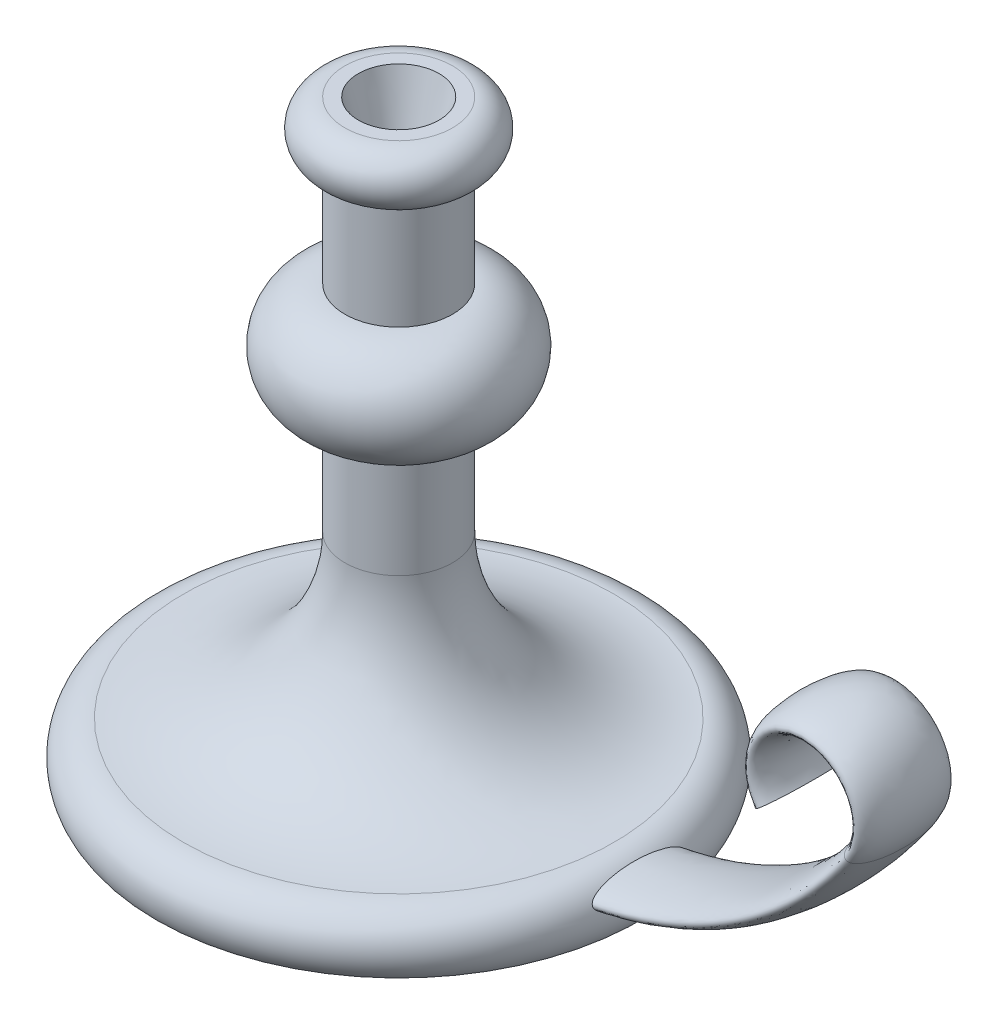
ISO-10303-21;
HEADER;
FILE_DESCRIPTION(('STEP AP214'),'2;1');
FILE_NAME('part.step','',(''),(''),'','','');
FILE_SCHEMA(('AUTOMOTIVE_DESIGN { 1 0 10303 214 1 1 1 1 }'));
ENDSEC;
DATA;
#1=APPLICATION_CONTEXT('core data for automotive mechanical design processes');
#2=APPLICATION_PROTOCOL_DEFINITION('international standard','automotive_design',2000,#1);
#3=PRODUCT_CONTEXT('',#1,'mechanical');
#4=PRODUCT('Part','Part','',(#3));
#5=PRODUCT_RELATED_PRODUCT_CATEGORY('part','',(#4));
#6=PRODUCT_DEFINITION_FORMATION('','',#4);
#7=PRODUCT_DEFINITION_CONTEXT('part definition',#1,'design');
#8=PRODUCT_DEFINITION('design','',#6,#7);
#9=PRODUCT_DEFINITION_SHAPE('','',#8);
#10=(LENGTH_UNIT() NAMED_UNIT(*) SI_UNIT(.MILLI.,.METRE.));
#11=(NAMED_UNIT(*) PLANE_ANGLE_UNIT() SI_UNIT($,.RADIAN.));
#12=(NAMED_UNIT(*) SI_UNIT($,.STERADIAN.) SOLID_ANGLE_UNIT());
#13=UNCERTAINTY_MEASURE_WITH_UNIT(LENGTH_MEASURE(1.E-05),#10,'distance_accuracy_value','');
#14=(GEOMETRIC_REPRESENTATION_CONTEXT(3) GLOBAL_UNCERTAINTY_ASSIGNED_CONTEXT((#13)) GLOBAL_UNIT_ASSIGNED_CONTEXT((#10,
#11,#12)) REPRESENTATION_CONTEXT('',''));
#15=CARTESIAN_POINT('',(0.,0.,0.));
#16=DIRECTION('',(0.,0.,1.));
#17=DIRECTION('',(1.,0.,0.));
#18=AXIS2_PLACEMENT_3D('',#15,#16,#17);
#19=CARTESIAN_POINT('',(0.,7.50000000000003,0.));
#20=DIRECTION('',(0.,-1.,0.));
#21=DIRECTION('',(0.,0.,-1.));
#22=AXIS2_PLACEMENT_3D('',#19,#20,#21);
#23=TOROIDAL_SURFACE('',#22,80.,12.5);
#24=CARTESIAN_POINT('',(89.5597422043342,12.9414346567555,-17.5));
#25=CARTESIAN_POINT('',(89.5807278946485,12.8988393157081,-17.5000019534777));
#26=CARTESIAN_POINT('',(89.6018125795404,12.8563039357769,-17.4977816975197));
#27=CARTESIAN_POINT('',(89.6440155813562,12.7716938339371,-17.489002543543));
#28=CARTESIAN_POINT('',(89.6651339056647,12.7296192360718,-17.4824425050804));
#29=CARTESIAN_POINT('',(89.728328929782,12.6045076597417,-17.4565216692095));
#30=CARTESIAN_POINT('',(89.7702246464786,12.5226255894255,-17.4309204730636));
#31=CARTESIAN_POINT('',(89.8644276523312,12.3407735771966,-17.3563532007827));
#32=CARTESIAN_POINT('',(89.916211748319,12.242484901666,-17.3027527423027));
#33=CARTESIAN_POINT('',(90.01638786814,12.0551458272008,-17.178826321144));
#34=CARTESIAN_POINT('',(90.0647710548456,11.966119226993,-17.1084587296403));
#35=CARTESIAN_POINT('',(90.1524531790238,11.8069845229249,-16.9652391551481));
#36=CARTESIAN_POINT('',(90.1921458014336,11.7358878994478,-16.8936963434585));
#37=CARTESIAN_POINT('',(90.2690886261225,11.5996259068224,-16.7438969488311));
#38=CARTESIAN_POINT('',(90.3063367280021,11.5344656201533,-16.665634722265));
#39=CARTESIAN_POINT('',(90.3786756485819,11.4092540815105,-16.5039763875565));
#40=CARTESIAN_POINT('',(90.4137624747614,11.349212210629,-16.4205713158719));
#41=CARTESIAN_POINT('',(90.4819450166471,11.2336894025402,-16.2499454917114));
#42=CARTESIAN_POINT('',(90.5150413047902,11.1782071523835,-16.162725848809));
#43=CARTESIAN_POINT('',(90.5839705930101,11.0637251825689,-15.9728919395737));
#44=CARTESIAN_POINT('',(90.6195406839562,11.0053156128849,-15.8698282905888));
#45=CARTESIAN_POINT('',(90.6886668526269,10.8929143897208,-15.6606649910659));
#46=CARTESIAN_POINT('',(90.7222226971282,10.8389232475745,-15.5545649910506));
#47=CARTESIAN_POINT('',(90.787486486134,10.7348751403119,-15.3401290691865));
#48=CARTESIAN_POINT('',(90.8191972688173,10.6848120890841,-15.2317969483067));
#49=CARTESIAN_POINT('',(90.881005962979,10.5880683385414,-15.0131968985225));
#50=CARTESIAN_POINT('',(90.9111039714558,10.5413874357516,-14.9029290865687));
#51=CARTESIAN_POINT('',(90.979897363352,10.4355491517098,-14.6427529331226));
#52=CARTESIAN_POINT('',(91.0180072010883,10.377593665576,-14.4922012075481));
#53=CARTESIAN_POINT('',(91.0918875553169,10.2663462891692,-14.1888070722871));
#54=CARTESIAN_POINT('',(91.1276577411367,10.2130550577559,-14.0359643425398));
#55=CARTESIAN_POINT('',(91.1971197458645,10.1105127689612,-13.7282685712582));
#56=CARTESIAN_POINT('',(91.2308091946811,10.0612662985098,-13.573413471871));
#57=CARTESIAN_POINT('',(91.2962483962878,9.96642044574799,-13.262180104172));
#58=CARTESIAN_POINT('',(91.3279980241889,9.92082129819992,-13.1058017385396));
#59=CARTESIAN_POINT('',(91.4205951755327,9.78887458660797,-12.6346162266685));
#60=CARTESIAN_POINT('',(91.4787589060981,9.70742476979595,-12.3179025042442));
#61=CARTESIAN_POINT('',(91.5890957852254,9.55493826130152,-11.6792188898602));
#62=CARTESIAN_POINT('',(91.641236506382,9.48395741425905,-11.357230318611));
#63=CARTESIAN_POINT('',(91.7397682682944,9.35136221163196,-10.7107316640823));
#64=CARTESIAN_POINT('',(91.7861636672357,9.28974074823245,-10.3862236929834));
#65=CARTESIAN_POINT('',(91.8736976604511,9.17463718318053,-9.73512886653572));
#66=CARTESIAN_POINT('',(91.9148370779327,9.12115380666535,-9.40854234516818));
#67=CARTESIAN_POINT('',(91.9930777751443,9.02031209920317,-8.74630339912616));
#68=CARTESIAN_POINT('',(92.0300669877613,8.97311921137159,-8.4106126926434));
#69=CARTESIAN_POINT('',(92.0991833927575,8.88559842477434,-7.73783252743947));
#70=CARTESIAN_POINT('',(92.1313104056235,8.84527077946752,-7.40074301754614));
#71=CARTESIAN_POINT('',(92.1909161961866,8.77092313439268,-6.72537142355348));
#72=CARTESIAN_POINT('',(92.2183937480205,8.73690479789182,-6.38708904887194));
#73=CARTESIAN_POINT('',(92.2688480816039,8.674768403045,-5.70964427774293));
#74=CARTESIAN_POINT('',(92.2918247141674,8.64665054027193,-5.37048185250302));
#75=CARTESIAN_POINT('',(92.3540877228586,8.57076604630488,-4.35367181244671));
#76=CARTESIAN_POINT('',(92.3868571977359,8.53128338370555,-3.6749838964165));
#77=CARTESIAN_POINT('',(92.4356134743347,8.47274161832895,-2.31614711504073));
#78=CARTESIAN_POINT('',(92.4515998737813,8.45368300509715,-1.63599821506827));
#79=CARTESIAN_POINT('',(92.4661200478781,8.43637339284854,-0.357955102331974));
#80=CARTESIAN_POINT('',(92.4665389208555,8.43587490179707,0.239888856143631));
#81=CARTESIAN_POINT('',(92.4546362797528,8.4500624126083,1.43536153859163));
#82=CARTESIAN_POINT('',(92.4423128974783,8.46475064105844,2.0329902181484));
#83=CARTESIAN_POINT('',(92.4047541650815,8.50976680779929,3.22745109478543));
#84=CARTESIAN_POINT('',(92.379514731688,8.54009969200437,3.82428298010724));
#85=CARTESIAN_POINT('',(92.3157217367252,8.61743320229676,5.01694606233261));
#86=CARTESIAN_POINT('',(92.2771508465328,8.66445552395919,5.61277493756131));
#87=CARTESIAN_POINT('',(92.1861026743767,8.77678784246256,6.80153886380942));
#88=CARTESIAN_POINT('',(92.1336290020919,8.84209309262499,7.39447462535094));
#89=CARTESIAN_POINT('',(92.0437550848418,8.95574227206711,8.28055229820517));
#90=CARTESIAN_POINT('',(92.0119455213755,8.99622894552013,8.57528682166731));
#91=CARTESIAN_POINT('',(91.9444204496405,9.08291539794889,9.16346094428889));
#92=CARTESIAN_POINT('',(91.9087051114865,9.12911492811459,9.4569005992672));
#93=CARTESIAN_POINT('',(91.8331309715698,9.22782929334069,10.0422906036684));
#94=CARTESIAN_POINT('',(91.7932707518514,9.28034629056383,10.3342404073469));
#95=CARTESIAN_POINT('',(91.7091179167369,9.39245062081631,10.9161852811053));
#96=CARTESIAN_POINT('',(91.6648247441272,9.45203884286031,11.2061801005453));
#97=CARTESIAN_POINT('',(91.5713925727481,9.57931645333882,11.7838191658169));
#98=CARTESIAN_POINT('',(91.5222504482681,9.64701107336927,12.0714617643073));
#99=CARTESIAN_POINT('',(91.4186796874406,9.79172730085909,12.6430805537632));
#100=CARTESIAN_POINT('',(91.3642572573635,9.86873798424097,12.9270606150355));
#101=CARTESIAN_POINT('',(91.2493765391174,10.033952974788,13.4904217181467));
#102=CARTESIAN_POINT('',(91.1889212109097,10.1221517983454,13.7698049377449));
#103=CARTESIAN_POINT('',(91.0929373870874,10.2648274882363,14.1839125047647));
#104=CARTESIAN_POINT('',(91.0600757486261,10.314090418185,14.3210581267387));
#105=CARTESIAN_POINT('',(90.9923938569386,10.4165511027192,14.593376347765));
#106=CARTESIAN_POINT('',(90.9575737807137,10.4697485018484,14.7285491237345));
#107=CARTESIAN_POINT('',(90.8810851838777,10.587845134408,15.0138774923678));
#108=CARTESIAN_POINT('',(90.8391147723957,10.6533666208412,15.1636969104749));
#109=CARTESIAN_POINT('',(90.7519625692612,10.7912189771815,15.4593295355901));
#110=CARTESIAN_POINT('',(90.7067794219568,10.8635527258308,15.605141014985));
#111=CARTESIAN_POINT('',(90.6128939496975,11.0160439629677,15.8905749729623));
#112=CARTESIAN_POINT('',(90.5642084544311,11.0961646105686,16.0302224467125));
#113=CARTESIAN_POINT('',(90.4624897667354,11.2662530107873,16.3016394850687));
#114=CARTESIAN_POINT('',(90.4094613083908,11.3562100760681,16.4334173639363));
#115=CARTESIAN_POINT('',(90.3114276481005,11.5255085385048,16.6553108138959));
#116=CARTESIAN_POINT('',(90.2675273757817,11.6022608890606,16.747864447136));
#117=CARTESIAN_POINT('',(90.1761749534326,11.7643292238687,16.9236630994731));
#118=CARTESIAN_POINT('',(90.1287172073378,11.849658775493,17.0068929161981));
#119=CARTESIAN_POINT('',(90.0292807633426,12.0313291797368,17.160728121925));
#120=CARTESIAN_POINT('',(89.9772518064337,12.1277974407354,17.2311575389091));
#121=CARTESIAN_POINT('',(89.8965437818878,12.2800613987942,17.3212876850735));
#122=CARTESIAN_POINT('',(89.8692277989253,12.3320164153137,17.3487242132161));
#123=CARTESIAN_POINT('',(89.8138320311431,12.4382955168478,17.3975211145679));
#124=CARTESIAN_POINT('',(89.7857527202502,12.4926181439799,17.4188851676711));
#125=CARTESIAN_POINT('',(89.7185869780336,12.6237048005599,17.4611772226903));
#126=CARTESIAN_POINT('',(89.6792533408886,12.7013692224277,17.4790502108363));
#127=CARTESIAN_POINT('',(89.6005512815564,12.8586256339485,17.4997317533412));
#128=CARTESIAN_POINT('',(89.5611829132233,12.9382160139949,17.5025524785485));
#129=CARTESIAN_POINT('',(89.4835317885696,13.0969633423244,17.4927372657774));
#130=CARTESIAN_POINT('',(89.4452490812937,13.1761202708964,17.4801006306501));
#131=CARTESIAN_POINT('',(89.3707047667355,13.3318071774563,17.440649407729));
#132=CARTESIAN_POINT('',(89.3344452993771,13.4083343423531,17.4138201116179));
#133=CARTESIAN_POINT('',(89.2510611220235,13.5858554385683,17.3357126521072));
#134=CARTESIAN_POINT('',(89.2050998650831,13.684982377722,17.2790047620841));
#135=CARTESIAN_POINT('',(89.1180744174556,13.874427631182,17.1491670423826));
#136=CARTESIAN_POINT('',(89.0770301058259,13.9647099356687,17.0759737821298));
#137=CARTESIAN_POINT('',(89.0037033744711,14.1271434857571,16.9270577307039));
#138=CARTESIAN_POINT('',(88.9709541551903,14.2001945680732,16.8525208708986));
#139=CARTESIAN_POINT('',(88.908496842619,14.3401811690449,16.697029269211));
#140=CARTESIAN_POINT('',(88.8787841266134,14.4071259665769,16.6160846261893));
#141=CARTESIAN_POINT('',(88.8217814388549,14.5359995630883,16.4490709627678));
#142=CARTESIAN_POINT('',(88.7944998605827,14.5979109242412,16.362985782321));
#143=CARTESIAN_POINT('',(88.7420667437369,14.717173406466,16.1870697873631));
#144=CARTESIAN_POINT('',(88.7169159331093,14.7745229686601,16.0972377082951));
#145=CARTESIAN_POINT('',(88.6682699235337,14.8855899090513,15.9140699306462));
#146=CARTESIAN_POINT('',(88.6447869137156,14.9392804489426,15.8207148279059));
#147=CARTESIAN_POINT('',(88.5993971939428,15.0431008843882,15.6316626961433));
#148=CARTESIAN_POINT('',(88.5774907604158,15.0932301555102,15.5359652603524));
#149=CARTESIAN_POINT('',(88.513751478622,15.2390285874186,15.2458062448787));
#150=CARTESIAN_POINT('',(88.4739596847913,15.329968547736,15.0485147207847));
#151=CARTESIAN_POINT('',(88.3985337506615,15.5017775203626,14.6487152633388));
#152=CARTESIAN_POINT('',(88.3629029634839,15.5826384140041,14.4462032813474));
#153=CARTESIAN_POINT('',(88.2948356711212,15.7363066128672,14.0365764701689));
#154=CARTESIAN_POINT('',(88.2624142295169,15.8090761199816,13.8294450545349));
#155=CARTESIAN_POINT('',(88.2003835751382,15.9473648801957,13.412628987176));
#156=CARTESIAN_POINT('',(88.1707714189814,16.0128917338223,13.2029472733582));
#157=CARTESIAN_POINT('',(88.1139049361938,16.1377375745621,12.78149499463));
#158=CARTESIAN_POINT('',(88.0866500408508,16.1970580597505,12.5697249473626));
#159=CARTESIAN_POINT('',(88.027617257203,16.3244235662306,12.0912931700776));
#160=CARTESIAN_POINT('',(87.9964138193044,16.3909381265495,11.8241540502342));
#161=CARTESIAN_POINT('',(87.9367717636617,16.5165936764721,11.2878278414646));
#162=CARTESIAN_POINT('',(87.9083334164421,16.5757339447661,11.018640554927));
#163=CARTESIAN_POINT('',(87.8539266282972,16.6875098948958,10.4785408424879));
#164=CARTESIAN_POINT('',(87.8279593730487,16.7401424577996,10.2076276543189));
#165=CARTESIAN_POINT('',(87.7783184309331,16.8395301522938,9.66451167999782));
#166=CARTESIAN_POINT('',(87.7546448506396,16.8862850108119,9.39230883453876));
#167=CARTESIAN_POINT('',(87.6869994555325,17.0182803050949,8.57578965921736));
#168=CARTESIAN_POINT('',(87.6462388525846,17.0955854003688,8.02991167225398));
#169=CARTESIAN_POINT('',(87.5728065515611,17.2320145687303,6.93552385093938));
#170=CARTESIAN_POINT('',(87.5401330675682,17.2911426566328,6.38701462498024));
#171=CARTESIAN_POINT('',(87.4828441952971,17.3930876120975,5.28955884850833));
#172=CARTESIAN_POINT('',(87.4582074588681,17.4359477429323,4.74061740412483));
#173=CARTESIAN_POINT('',(87.4169410999172,17.5068884934702,3.64146108218668));
#174=CARTESIAN_POINT('',(87.4003119088603,17.534968316784,3.09124613761759));
#175=CARTESIAN_POINT('',(87.375169948199,17.5771566462025,1.98980868969185));
#176=CARTESIAN_POINT('',(87.3666614689744,17.5912577671532,1.43858580772097));
#177=CARTESIAN_POINT('',(87.3578539704596,17.6058511840596,0.335909067645271));
#178=CARTESIAN_POINT('',(87.3575547550008,17.6063438052041,-0.215544784625368));
#179=CARTESIAN_POINT('',(87.3651677510509,17.5937352162513,-1.31815822776248));
#180=CARTESIAN_POINT('',(87.3730787250644,17.5806360547996,-1.86931785045099));
#181=CARTESIAN_POINT('',(87.3970372477743,17.5404868292746,-2.97097544677729));
#182=CARTESIAN_POINT('',(87.4130850653538,17.513436304176,-3.52147339794745));
#183=CARTESIAN_POINT('',(87.4531996813082,17.4446213827576,-4.62112135666799));
#184=CARTESIAN_POINT('',(87.4772644593792,17.4028606933019,-5.17027166874152));
#185=CARTESIAN_POINT('',(87.5333316774061,17.3033707612731,-6.26670053623542));
#186=CARTESIAN_POINT('',(87.5653334299482,17.2456429015516,-6.81397924959393));
#187=CARTESIAN_POINT('',(87.6208220531231,17.1429049509084,-7.65503321383776));
#188=CARTESIAN_POINT('',(87.641467966926,17.104233324674,-7.94978028808903));
#189=CARTESIAN_POINT('',(87.6851649593457,17.0212250701554,-8.5382946276224));
#190=CARTESIAN_POINT('',(87.7082159678751,16.9768886069427,-8.83206192119917));
#191=CARTESIAN_POINT('',(87.7568106691338,16.8820510369679,-9.41827197236908));
#192=CARTESIAN_POINT('',(87.7823533406002,16.8315524537745,-9.71071522164857));
#193=CARTESIAN_POINT('',(87.8360989952266,16.7237193681049,-10.2940938312753));
#194=CARTESIAN_POINT('',(87.8643018909558,16.6663850902741,-10.5850292408479));
#195=CARTESIAN_POINT('',(87.9147712499548,16.5622842610504,-11.0784529887227));
#196=CARTESIAN_POINT('',(87.9362980252954,16.5174691899789,-11.2814293835338));
#197=CARTESIAN_POINT('',(87.9809118301304,16.4236835134751,-11.6862455623079));
#198=CARTESIAN_POINT('',(88.0039988123354,16.3747130339803,-11.8880853805194));
#199=CARTESIAN_POINT('',(88.0519198244944,16.2721215384759,-12.2905621648846));
#200=CARTESIAN_POINT('',(88.0767553337325,16.2184965755429,-12.4911979528416));
#201=CARTESIAN_POINT('',(88.1283787004668,16.1060707847339,-12.8907612736839));
#202=CARTESIAN_POINT('',(88.1551664933024,16.0472701282664,-13.0896888629022));
#203=CARTESIAN_POINT('',(88.2109999780505,15.9237718205576,-13.4854201231412));
#204=CARTESIAN_POINT('',(88.2400459194859,15.8590735174964,-13.6822235567011));
#205=CARTESIAN_POINT('',(88.3008027999433,15.7228691935852,-14.0730419872898));
#206=CARTESIAN_POINT('',(88.3325134779585,15.6513638393843,-14.2670572552402));
#207=CARTESIAN_POINT('',(88.3991424541961,15.5003948115858,-14.6511973591139));
#208=CARTESIAN_POINT('',(88.4340575115817,15.4209391715425,-14.8413258930663));
#209=CARTESIAN_POINT('',(88.5079196083049,15.2523848762564,-15.2164401400172));
#210=CARTESIAN_POINT('',(88.5468648114131,15.1632906117648,-15.4014281468494));
#211=CARTESIAN_POINT('',(88.6092096238852,15.0206579718868,-15.6733114229646));
#212=CARTESIAN_POINT('',(88.6306485895102,14.9716086740024,-15.7630166800374));
#213=CARTESIAN_POINT('',(88.6750422753313,14.870124861522,-15.9401002079375));
#214=CARTESIAN_POINT('',(88.6979967332498,14.8176909327198,-16.0274788777601));
#215=CARTESIAN_POINT('',(88.74568401018,14.7089478844273,-16.1993887567135));
#216=CARTESIAN_POINT('',(88.7704179688271,14.6526362825891,-16.2839180892544));
#217=CARTESIAN_POINT('',(88.821948485748,14.5356422617904,-16.4492391224754));
#218=CARTESIAN_POINT('',(88.8487445345049,14.4749609227744,-16.5300317386031));
#219=CARTESIAN_POINT('',(88.8976102788188,14.3647434848949,-16.666716843305));
#220=CARTESIAN_POINT('',(88.9191374191611,14.316323032208,-16.7236955334946));
#221=CARTESIAN_POINT('',(88.9637080676469,14.2164452982158,-16.8342912802674));
#222=CARTESIAN_POINT('',(88.9867519478514,14.1649872721062,-16.8879075056817));
#223=CARTESIAN_POINT('',(89.0583610181501,14.0058008216796,-17.0423310846556));
#224=CARTESIAN_POINT('',(89.1095289234105,13.8929758416956,-17.1370796109725));
#225=CARTESIAN_POINT('',(89.1999001554576,13.6963386208974,-17.2707956184665));
#226=CARTESIAN_POINT('',(89.2367505169323,13.6167644879682,-17.317550348063));
#227=CARTESIAN_POINT('',(89.3136877653851,13.452297416601,-17.3968468737186));
#228=CARTESIAN_POINT('',(89.3537667767867,13.3674175273964,-17.4294220837181));
#229=CARTESIAN_POINT('',(89.4217091217894,13.2251848973541,-17.4685967336684));
#230=CARTESIAN_POINT('',(89.448809384098,13.1688551716175,-17.4803204652976));
#231=CARTESIAN_POINT('',(89.5037947740349,13.0554594934971,-17.4960211898048));
#232=CARTESIAN_POINT('',(89.5316799819,12.9983934661741,-17.499997387795));
#233=CARTESIAN_POINT('',(89.5597422043342,12.9414346567555,-17.5));
#234=B_SPLINE_CURVE_WITH_KNOTS('',3,(#24,#25,#26,#27,#28,#29,#30,#31,#32,#33,#34,#35,#36,#37,
#38,#39,#40,#41,#42,#43,#44,#45,#46,#47,#48,#49,#50,#51,#52,#53,#54,#55,#56,#57,#58,#59,#60,#61,
#62,#63,#64,#65,#66,#67,#68,#69,#70,#71,#72,#73,#74,#75,#76,#77,#78,#79,#80,#81,#82,#83,#84,#85,
#86,#87,#88,#89,#90,#91,#92,#93,#94,#95,#96,#97,#98,#99,#100,#101,#102,#103,#104,#105,#106,#107,
#108,#109,#110,#111,#112,#113,#114,#115,#116,#117,#118,#119,#120,#121,#122,#123,#124,#125,#126,
#127,#128,#129,#130,#131,#132,#133,#134,#135,#136,#137,#138,#139,#140,#141,#142,#143,#144,#145,
#146,#147,#148,#149,#150,#151,#152,#153,#154,#155,#156,#157,#158,#159,#160,#161,#162,#163,#164,
#165,#166,#167,#168,#169,#170,#171,#172,#173,#174,#175,#176,#177,#178,#179,#180,#181,#182,#183,
#184,#185,#186,#187,#188,#189,#190,#191,#192,#193,#194,#195,#196,#197,#198,#199,#200,#201,#202,
#203,#204,#205,#206,#207,#208,#209,#210,#211,#212,#213,#214,#215,#216,#217,#218,#219,#220,#221,
#222,#223,#224,#225,#226,#227,#228,#229,#230,#231,#232,#233),.UNSPECIFIED.,.T.,.F.,(4,2,2,2,2,2,
2,2,2,2,2,2,2,2,2,2,2,2,2,2,2,2,2,2,2,2,2,2,2,2,2,2,2,2,2,2,2,2,2,2,2,2,2,2,2,2,2,2,2,2,2,2,2,2,
2,2,2,2,2,2,2,2,2,2,2,2,2,2,2,2,2,2,2,2,2,2,2,2,2,2,2,2,2,2,2,2,2,2,2,2,2,2,2,2,2,2,2,2,2,2,2,2,
2,2,4),(0.,0.142381357158815,0.284800145338809,0.569778369710398,0.937790990160509,
1.30672699797601,1.63143353328552,1.95641550824168,2.28198085179473,2.60745211744527,
2.97835758825745,3.3493059225314,3.71966767593572,4.09000712931062,4.58717127025774,
5.08440552627601,5.58219609730419,6.08001868322203,7.07612740491147,8.07737111401416,
9.07785060328476,10.0781732018629,11.1010679437462,12.1240004418369,13.1472022244407,
14.1704379160043,16.2117115539474,18.2530341182272,20.0462457692419,21.839720367684,
23.6337623045227,25.4301450150665,27.2260617741975,28.1235892294178,29.0210776087004,
29.9188740333848,30.8167834514322,31.7152755049922,32.6127240115719,33.5097343419005,
33.9578247270816,34.405874679233,34.9121604747939,35.4186611861169,35.9228725276492,
36.4265413835618,36.8100240505595,37.1941231504199,37.5831580539592,37.7772586450042,
37.9712413599169,38.2366258142318,38.50179565338,38.766977452507,39.0324346081148,
39.3996555983549,39.7683144393121,40.095986637524,40.4231523204128,40.7514069982213,
41.0797733710077,41.410334443638,41.7409533344654,42.4030339566271,43.0656444835734,
43.7312306850952,44.3961116446157,45.0608317450505,45.891860855308,46.7229711882502,
47.5544783139759,48.3860240564153,50.0440426041178,51.7016946763014,53.3549069476189,
55.0082082878455,56.6623826267338,58.3165174374182,59.9704029618925,61.6243431428206,
63.2778668395638,64.9312473761672,65.825161771741,66.7190501248697,67.6125736254214,
68.506067769684,69.132954633067,69.7598225042297,70.3872272415094,71.0146112082216,
71.6420645989516,72.2694566030661,72.8962209263454,73.5227009279519,73.8360175198395,
74.1492800292301,74.4627449766596,74.7761327179493,75.0094189443192,75.2427626113343,
75.7080186392218,76.0052441465113,76.3017654013241,76.4921392885519,76.6825327068869),.UNSPECIFIED.);
#235=CARTESIAN_POINT('',(89.5597422043342,12.9414346567555,-17.5));
#236=VERTEX_POINT('',#235);
#237=EDGE_CURVE('E45',#236,#236,#234,.T.);
#238=ORIENTED_EDGE('',*,*,#237,.T.);
#239=EDGE_LOOP('',(#238));
#240=FACE_BOUND('',#239,.T.);
#241=CARTESIAN_POINT('',(0.,0.,0.));
#242=DIRECTION('',(0.,-1.,0.));
#243=DIRECTION('',(0.,0.,-1.));
#244=AXIS2_PLACEMENT_3D('',#241,#242,#243);
#245=CIRCLE('',#244,90.);
#246=CARTESIAN_POINT('',(0.,0.,-90.));
#247=VERTEX_POINT('',#246);
#248=EDGE_CURVE('E71',#247,#247,#245,.T.);
#249=ORIENTED_EDGE('',*,*,#248,.F.);
#250=EDGE_LOOP('',(#249));
#251=FACE_BOUND('',#250,.T.);
#252=CARTESIAN_POINT('',(0.,20.,0.));
#253=DIRECTION('',(0.,-1.,0.));
#254=DIRECTION('',(0.,0.,-1.));
#255=AXIS2_PLACEMENT_3D('',#252,#253,#254);
#256=CIRCLE('',#255,80.);
#257=CARTESIAN_POINT('',(0.,20.,-80.));
#258=VERTEX_POINT('',#257);
#259=EDGE_CURVE('E10',#258,#258,#256,.T.);
#260=ORIENTED_EDGE('',*,*,#259,.T.);
#261=EDGE_LOOP('',(#260));
#262=FACE_BOUND('',#261,.T.);
#263=ADVANCED_FACE('F41',(#240,#251,#262),#23,.T.);
#264=CARTESIAN_POINT('',(0.,80.,0.));
#265=DIRECTION('',(0.,-1.,0.));
#266=DIRECTION('',(0.,0.,-1.));
#267=AXIS2_PLACEMENT_3D('',#264,#265,#266);
#268=TOROIDAL_SURFACE('',#267,80.,60.);
#269=ORIENTED_EDGE('',*,*,#259,.F.);
#270=EDGE_LOOP('',(#269));
#271=FACE_BOUND('',#270,.T.);
#272=CARTESIAN_POINT('',(0.,80.,0.));
#273=DIRECTION('',(0.,-1.,0.));
#274=DIRECTION('',(0.,0.,-1.));
#275=AXIS2_PLACEMENT_3D('',#272,#273,#274);
#276=CIRCLE('',#275,20.);
#277=CARTESIAN_POINT('',(0.,80.,-20.));
#278=VERTEX_POINT('',#277);
#279=EDGE_CURVE('E53',#278,#278,#276,.T.);
#280=ORIENTED_EDGE('',*,*,#279,.T.);
#281=EDGE_LOOP('',(#280));
#282=FACE_BOUND('',#281,.T.);
#283=ADVANCED_FACE('F109',(#271,#282),#268,.F.);
#284=CARTESIAN_POINT('',(0.,0.,0.));
#285=DIRECTION('',(0.,-1.,0.));
#286=DIRECTION('',(0.,0.,-1.));
#287=AXIS2_PLACEMENT_3D('',#284,#285,#286);
#288=CYLINDRICAL_SURFACE('',#287,20.);
#289=ORIENTED_EDGE('',*,*,#279,.F.);
#290=EDGE_LOOP('',(#289));
#291=FACE_BOUND('',#290,.T.);
#292=CARTESIAN_POINT('',(0.,120.,0.));
#293=DIRECTION('',(0.,-1.,0.));
#294=DIRECTION('',(0.,0.,-1.));
#295=AXIS2_PLACEMENT_3D('',#292,#293,#294);
#296=CIRCLE('',#295,20.);
#297=CARTESIAN_POINT('',(0.,120.,-20.));
#298=VERTEX_POINT('',#297);
#299=EDGE_CURVE('E57',#298,#298,#296,.T.);
#300=ORIENTED_EDGE('',*,*,#299,.T.);
#301=EDGE_LOOP('',(#300));
#302=FACE_BOUND('',#301,.T.);
#303=ADVANCED_FACE('F114',(#291,#302),#288,.T.);
#304=CARTESIAN_POINT('',(0.,140.,0.));
#305=DIRECTION('',(0.,-1.,0.));
#306=DIRECTION('',(0.,0.,-1.));
#307=AXIS2_PLACEMENT_3D('',#304,#305,#306);
#308=DEGENERATE_TOROIDAL_SURFACE('',#307,19.9999999999999,20.,.T.);
#309=ORIENTED_EDGE('',*,*,#299,.F.);
#310=EDGE_LOOP('',(#309));
#311=FACE_BOUND('',#310,.T.);
#312=CARTESIAN_POINT('',(0.,160.,0.));
#313=DIRECTION('',(0.,-1.,0.));
#314=DIRECTION('',(0.,0.,-1.));
#315=AXIS2_PLACEMENT_3D('',#312,#313,#314);
#316=CIRCLE('',#315,20.);
#317=CARTESIAN_POINT('',(0.,160.,-20.));
#318=VERTEX_POINT('',#317);
#319=EDGE_CURVE('E62',#318,#318,#316,.T.);
#320=ORIENTED_EDGE('',*,*,#319,.T.);
#321=EDGE_LOOP('',(#320));
#322=FACE_BOUND('',#321,.T.);
#323=ADVANCED_FACE('F104',(#311,#322),#308,.T.);
#324=CARTESIAN_POINT('',(0.,0.,0.));
#325=DIRECTION('',(0.,-1.,0.));
#326=DIRECTION('',(0.,0.,-1.));
#327=AXIS2_PLACEMENT_3D('',#324,#325,#326);
#328=CYLINDRICAL_SURFACE('',#327,20.);
#329=ORIENTED_EDGE('',*,*,#319,.F.);
#330=EDGE_LOOP('',(#329));
#331=FACE_BOUND('',#330,.T.);
#332=CARTESIAN_POINT('',(0.,200.,0.));
#333=DIRECTION('',(0.,-1.,0.));
#334=DIRECTION('',(0.,0.,-1.));
#335=AXIS2_PLACEMENT_3D('',#332,#333,#334);
#336=CIRCLE('',#335,20.);
#337=CARTESIAN_POINT('',(0.,200.,-20.));
#338=VERTEX_POINT('',#337);
#339=EDGE_CURVE('E65',#338,#338,#336,.T.);
#340=ORIENTED_EDGE('',*,*,#339,.T.);
#341=EDGE_LOOP('',(#340));
#342=FACE_BOUND('',#341,.T.);
#343=ADVANCED_FACE('F98',(#331,#342),#328,.T.);
#344=CARTESIAN_POINT('',(0.,210.,0.));
#345=DIRECTION('',(0.,-1.,0.));
#346=DIRECTION('',(0.,0.,-1.));
#347=AXIS2_PLACEMENT_3D('',#344,#345,#346);
#348=TOROIDAL_SURFACE('',#347,20.,10.);
#349=ORIENTED_EDGE('',*,*,#339,.F.);
#350=EDGE_LOOP('',(#349));
#351=FACE_BOUND('',#350,.T.);
#352=CARTESIAN_POINT('',(0.,220.,0.));
#353=DIRECTION('',(0.,-1.,0.));
#354=DIRECTION('',(0.,0.,-1.));
#355=AXIS2_PLACEMENT_3D('',#352,#353,#354);
#356=CIRCLE('',#355,20.);
#357=CARTESIAN_POINT('',(0.,220.,-20.));
#358=VERTEX_POINT('',#357);
#359=EDGE_CURVE('E68',#358,#358,#356,.T.);
#360=ORIENTED_EDGE('',*,*,#359,.T.);
#361=EDGE_LOOP('',(#360));
#362=FACE_BOUND('',#361,.T.);
#363=ADVANCED_FACE('F93',(#351,#362),#348,.T.);
#364=CARTESIAN_POINT('',(0.,220.,0.));
#365=DIRECTION('',(0.,-1.,0.));
#366=DIRECTION('',(0.,0.,-1.));
#367=AXIS2_PLACEMENT_3D('',#364,#365,#366);
#368=PLANE('',#367);
#369=CARTESIAN_POINT('',(0.,220.,0.));
#370=DIRECTION('',(0.,1.,0.));
#371=DIRECTION('',(0.,0.,1.));
#372=AXIS2_PLACEMENT_3D('',#369,#370,#371);
#373=CIRCLE('',#372,15.);
#374=CARTESIAN_POINT('',(0.,220.,15.));
#375=VERTEX_POINT('',#374);
#376=EDGE_CURVE('E83',#375,#375,#373,.T.);
#377=ORIENTED_EDGE('',*,*,#376,.F.);
#378=EDGE_LOOP('',(#377));
#379=FACE_BOUND('',#378,.T.);
#380=ORIENTED_EDGE('',*,*,#359,.F.);
#381=EDGE_LOOP('',(#380));
#382=FACE_BOUND('',#381,.T.);
#383=ADVANCED_FACE('F89',(#379,#382),#368,.F.);
#384=CARTESIAN_POINT('',(0.,0.,0.));
#385=DIRECTION('',(0.,-1.,0.));
#386=DIRECTION('',(0.,0.,-1.));
#387=AXIS2_PLACEMENT_3D('',#384,#385,#386);
#388=PLANE('',#387);
#389=ORIENTED_EDGE('',*,*,#248,.T.);
#390=EDGE_LOOP('',(#389));
#391=FACE_BOUND('',#390,.T.);
#392=ADVANCED_FACE('F92',(#391),#388,.T.);
#393=CARTESIAN_POINT('',(60.,10.,-17.5));
#394=CARTESIAN_POINT('',(110.410191303973,10.,-17.5));
#395=CARTESIAN_POINT('',(155.026295870831,33.4646670673665,-17.5));
#396=CARTESIAN_POINT('',(183.592070943083,75.,-17.5));
#397=CARTESIAN_POINT('',(60.,20.,-17.5));
#398=CARTESIAN_POINT('',(107.049511883708,20.,-17.5));
#399=CARTESIAN_POINT('',(148.691209479443,41.9003559295421,-17.5));
#400=CARTESIAN_POINT('',(175.352599546877,80.6666666666666,-17.5));
#401=CARTESIAN_POINT('',(60.,20.,17.5));
#402=CARTESIAN_POINT('',(107.049511883708,20.,17.5));
#403=CARTESIAN_POINT('',(148.691209479443,41.9003559295421,17.5));
#404=CARTESIAN_POINT('',(175.352599546877,80.6666666666666,17.5));
#405=CARTESIAN_POINT('',(60.,10.,17.5));
#406=CARTESIAN_POINT('',(110.410191303973,10.,17.5));
#407=CARTESIAN_POINT('',(155.026295870831,33.4646670673665,17.5));
#408=CARTESIAN_POINT('',(183.592070943083,75.,17.5));
#409=CARTESIAN_POINT('',(60.,0.,17.5));
#410=CARTESIAN_POINT('',(113.770870724238,0.,17.5));
#411=CARTESIAN_POINT('',(161.36138226222,25.0289782051909,17.5));
#412=CARTESIAN_POINT('',(191.831542339288,69.3333333333333,17.5));
#413=CARTESIAN_POINT('',(60.,0.,-17.5));
#414=CARTESIAN_POINT('',(113.770870724238,0.,-17.5));
#415=CARTESIAN_POINT('',(161.36138226222,25.0289782051909,-17.5));
#416=CARTESIAN_POINT('',(191.831542339288,69.3333333333333,-17.5));
#417=CARTESIAN_POINT('',(60.,10.,-17.5));
#418=CARTESIAN_POINT('',(110.410191303973,10.,-17.5));
#419=CARTESIAN_POINT('',(155.026295870831,33.4646670673665,-17.5));
#420=CARTESIAN_POINT('',(183.592070943083,75.,-17.5));
#421=(BOUNDED_SURFACE() B_SPLINE_SURFACE(3,3,((#393,#394,#395,#396),(#397,#398,#399,#400),(#401,
#402,#403,#404),(#405,#406,#407,#408),(#409,#410,#411,#412),(#413,#414,#415,#416),(#417,#418,
#419,#420)),.UNSPECIFIED.,.T.,.F.,.F.) B_SPLINE_SURFACE_WITH_KNOTS((4,3,4),(4,4),(0.,0.5,1.),
(0.,1.),.UNSPECIFIED.) GEOMETRIC_REPRESENTATION_ITEM() RATIONAL_B_SPLINE_SURFACE(((1.,
0.923374135437856,0.923374135437856,1.),(0.333333333333333,0.307791378479285,0.307791378479285,
0.333333333333333),(0.333333333333333,0.307791378479285,0.307791378479285,0.333333333333333),
(1.,0.923374135437856,0.923374135437856,1.),(0.333333333333333,0.307791378479285,
0.307791378479285,0.333333333333333),(0.333333333333333,0.307791378479285,0.307791378479285,
0.333333333333333),(1.,0.923374135437856,0.923374135437856,1.))) REPRESENTATION_ITEM('') SURFACE());
#422=CARTESIAN_POINT('',(183.592070943083,75.,0.));
#423=DIRECTION('',(0.566666666666667,0.823947139620552,0.));
#424=DIRECTION('',(0.,0.,-1.));
#425=AXIS2_PLACEMENT_3D('',#422,#423,#424);
#426=ELLIPSE('',#425,17.5,5.);
#427=CARTESIAN_POINT('',(183.592070943083,75.,-17.5));
#428=VERTEX_POINT('',#427);
#429=EDGE_CURVE('E77',#428,#428,#426,.T.);
#430=ORIENTED_EDGE('',*,*,#429,.F.);
#431=EDGE_LOOP('',(#430));
#432=FACE_BOUND('',#431,.T.);
#433=ORIENTED_EDGE('',*,*,#237,.F.);
#434=EDGE_LOOP('',(#433));
#435=FACE_BOUND('',#434,.T.);
#436=ADVANCED_FACE('F122',(#432,#435),#421,.T.);
#437=CARTESIAN_POINT('',(150.634185358261,75.,0.));
#438=DIRECTION('',(0.566666666666667,-0.823947139620552,0.));
#439=DIRECTION('',(0.,0.,-1.));
#440=AXIS2_PLACEMENT_3D('',#437,#438,#439);
#441=PLANE('',#440);
#442=CARTESIAN_POINT('',(150.634185358261,75.,0.));
#443=DIRECTION('',(0.566666666666667,-0.823947139620552,0.));
#444=DIRECTION('',(0.,0.,-1.));
#445=AXIS2_PLACEMENT_3D('',#442,#443,#444);
#446=ELLIPSE('',#445,17.5,5.);
#447=CARTESIAN_POINT('',(150.634185358261,75.,-17.5));
#448=VERTEX_POINT('',#447);
#449=EDGE_CURVE('E74',#448,#448,#446,.T.);
#450=ORIENTED_EDGE('',*,*,#449,.T.);
#451=EDGE_LOOP('',(#450));
#452=FACE_BOUND('',#451,.T.);
#453=ADVANCED_FACE('F127',(#452),#441,.T.);
#454=CARTESIAN_POINT('',(183.592070943083,75.,-17.5));
#455=CARTESIAN_POINT('',(193.981461744242,90.1064273523801,-17.5));
#456=CARTESIAN_POINT('',(185.447347211541,106.333333333333,-17.5));
#457=CARTESIAN_POINT('',(167.113128150672,106.333333333333,-17.5));
#458=CARTESIAN_POINT('',(148.778909089802,106.333333333333,-17.5));
#459=CARTESIAN_POINT('',(140.244794557101,90.1064273523801,-17.5));
#460=CARTESIAN_POINT('',(150.634185358261,75.,-17.5));
#461=CARTESIAN_POINT('',(175.352599546877,80.6666666666667,-17.5));
#462=CARTESIAN_POINT('',(180.547294947457,88.2198803428567,-17.5));
#463=CARTESIAN_POINT('',(176.280237681106,96.3333333333333,-17.5));
#464=CARTESIAN_POINT('',(167.113128150672,96.3333333333333,-17.5));
#465=CARTESIAN_POINT('',(157.946018620237,96.3333333333333,-17.5));
#466=CARTESIAN_POINT('',(153.678961353886,88.2198803428567,-17.5));
#467=CARTESIAN_POINT('',(158.873656754466,80.6666666666667,-17.5));
#468=CARTESIAN_POINT('',(175.352599546877,80.6666666666667,17.5));
#469=CARTESIAN_POINT('',(180.547294947457,88.2198803428567,17.5));
#470=CARTESIAN_POINT('',(176.280237681106,96.3333333333333,17.5));
#471=CARTESIAN_POINT('',(167.113128150672,96.3333333333333,17.5));
#472=CARTESIAN_POINT('',(157.946018620237,96.3333333333333,17.5));
#473=CARTESIAN_POINT('',(153.678961353886,88.2198803428567,17.5));
#474=CARTESIAN_POINT('',(158.873656754466,80.6666666666667,17.5));
#475=CARTESIAN_POINT('',(183.592070943083,75.,17.5));
#476=CARTESIAN_POINT('',(193.981461744242,90.1064273523801,17.5));
#477=CARTESIAN_POINT('',(185.447347211541,106.333333333333,17.5));
#478=CARTESIAN_POINT('',(167.113128150672,106.333333333333,17.5));
#479=CARTESIAN_POINT('',(148.778909089802,106.333333333333,17.5));
#480=CARTESIAN_POINT('',(140.244794557101,90.1064273523801,17.5));
#481=CARTESIAN_POINT('',(150.634185358261,75.,17.5));
#482=CARTESIAN_POINT('',(191.831542339288,69.3333333333333,17.5));
#483=CARTESIAN_POINT('',(207.415628541027,91.9929743619034,17.5));
#484=CARTESIAN_POINT('',(194.614456741976,116.333333333333,17.5));
#485=CARTESIAN_POINT('',(167.113128150672,116.333333333333,17.5));
#486=CARTESIAN_POINT('',(139.611799559367,116.333333333333,17.5));
#487=CARTESIAN_POINT('',(126.810627760316,91.9929743619035,17.5));
#488=CARTESIAN_POINT('',(142.394713962055,69.3333333333333,17.5));
#489=CARTESIAN_POINT('',(191.831542339288,69.3333333333333,-17.5));
#490=CARTESIAN_POINT('',(207.415628541027,91.9929743619034,-17.5));
#491=CARTESIAN_POINT('',(194.614456741976,116.333333333333,-17.5));
#492=CARTESIAN_POINT('',(167.113128150672,116.333333333333,-17.5));
#493=CARTESIAN_POINT('',(139.611799559367,116.333333333333,-17.5));
#494=CARTESIAN_POINT('',(126.810627760316,91.9929743619035,-17.5));
#495=CARTESIAN_POINT('',(142.394713962055,69.3333333333333,-17.5));
#496=CARTESIAN_POINT('',(183.592070943083,75.,-17.5));
#497=CARTESIAN_POINT('',(193.981461744242,90.1064273523801,-17.5));
#498=CARTESIAN_POINT('',(185.447347211541,106.333333333333,-17.5));
#499=CARTESIAN_POINT('',(167.113128150672,106.333333333333,-17.5));
#500=CARTESIAN_POINT('',(148.778909089802,106.333333333333,-17.5));
#501=CARTESIAN_POINT('',(140.244794557101,90.1064273523801,-17.5));
#502=CARTESIAN_POINT('',(150.634185358261,75.,-17.5));
#503=(BOUNDED_SURFACE() B_SPLINE_SURFACE(3,3,((#454,#455,#456,#457,#458,#459,#460),(#461,#462,
#463,#464,#465,#466,#467),(#468,#469,#470,#471,#472,#473,#474),(#475,#476,#477,#478,#479,#480,
#481),(#482,#483,#484,#485,#486,#487,#488),(#489,#490,#491,#492,#493,#494,#495),(#496,#497,#498,
#499,#500,#501,#502)),.UNSPECIFIED.,.T.,.F.,.F.) B_SPLINE_SURFACE_WITH_KNOTS((4,3,4),(4,3,4),
(0.,0.5,1.),(0.,0.5,1.),
.UNSPECIFIED.) GEOMETRIC_REPRESENTATION_ITEM() RATIONAL_B_SPLINE_SURFACE(((1.,0.643649778750421,
0.643649778750421,1.,0.643649778750421,0.643649778750421,1.),(0.333333333333333,
0.21454992625014,0.21454992625014,0.333333333333333,0.21454992625014,0.21454992625014,
0.333333333333333),(0.333333333333333,0.21454992625014,0.21454992625014,0.333333333333333,
0.21454992625014,0.21454992625014,0.333333333333333),(1.,0.643649778750421,0.643649778750421,1.,
0.643649778750421,0.643649778750421,1.),(0.333333333333333,0.21454992625014,0.21454992625014,
0.333333333333333,0.21454992625014,0.21454992625014,0.333333333333333),(0.333333333333333,
0.21454992625014,0.21454992625014,0.333333333333333,0.21454992625014,0.21454992625014,
0.333333333333333),(1.,0.643649778750421,0.643649778750421,1.,0.643649778750421,
0.643649778750421,1.))) REPRESENTATION_ITEM('') SURFACE());
#504=ORIENTED_EDGE('',*,*,#449,.F.);
#505=EDGE_LOOP('',(#504));
#506=FACE_BOUND('',#505,.T.);
#507=ORIENTED_EDGE('',*,*,#429,.T.);
#508=EDGE_LOOP('',(#507));
#509=FACE_BOUND('',#508,.T.);
#510=ADVANCED_FACE('F129',(#506,#509),#503,.T.);
#511=CARTESIAN_POINT('',(0.,220.,0.));
#512=DIRECTION('',(0.,1.,0.));
#513=DIRECTION('',(0.,0.,1.));
#514=AXIS2_PLACEMENT_3D('',#511,#512,#513);
#515=CONICAL_SURFACE('',#514,15.,0.26179938779915);
#516=CARTESIAN_POINT('',(0.,195.,0.));
#517=DIRECTION('',(0.,1.,0.));
#518=DIRECTION('',(0.,0.,1.));
#519=AXIS2_PLACEMENT_3D('',#516,#517,#518);
#520=CIRCLE('',#519,8.30127018922192);
#521=CARTESIAN_POINT('',(0.,195.,8.30127018922192));
#522=VERTEX_POINT('',#521);
#523=EDGE_CURVE('E80',#522,#522,#520,.T.);
#524=ORIENTED_EDGE('',*,*,#523,.F.);
#525=EDGE_LOOP('',(#524));
#526=FACE_BOUND('',#525,.T.);
#527=ORIENTED_EDGE('',*,*,#376,.T.);
#528=EDGE_LOOP('',(#527));
#529=FACE_BOUND('',#528,.T.);
#530=ADVANCED_FACE('F87',(#526,#529),#515,.F.);
#531=CARTESIAN_POINT('',(0.,195.,0.));
#532=DIRECTION('',(0.,1.,0.));
#533=DIRECTION('',(0.,0.,1.));
#534=AXIS2_PLACEMENT_3D('',#531,#532,#533);
#535=PLANE('',#534);
#536=ORIENTED_EDGE('',*,*,#523,.T.);
#537=EDGE_LOOP('',(#536));
#538=FACE_BOUND('',#537,.T.);
#539=ADVANCED_FACE('F154',(#538),#535,.T.);
#540=CLOSED_SHELL('',(#263,#283,#303,#323,#343,#363,#383,#392,#436,#453,#510,#530,#539));
#541=MANIFOLD_SOLID_BREP('B2',#540);
#542=ADVANCED_BREP_SHAPE_REPRESENTATION('',(#18,#541),#14);
#543=SHAPE_DEFINITION_REPRESENTATION(#9,#542);
ENDSEC;
END-ISO-10303-21;
